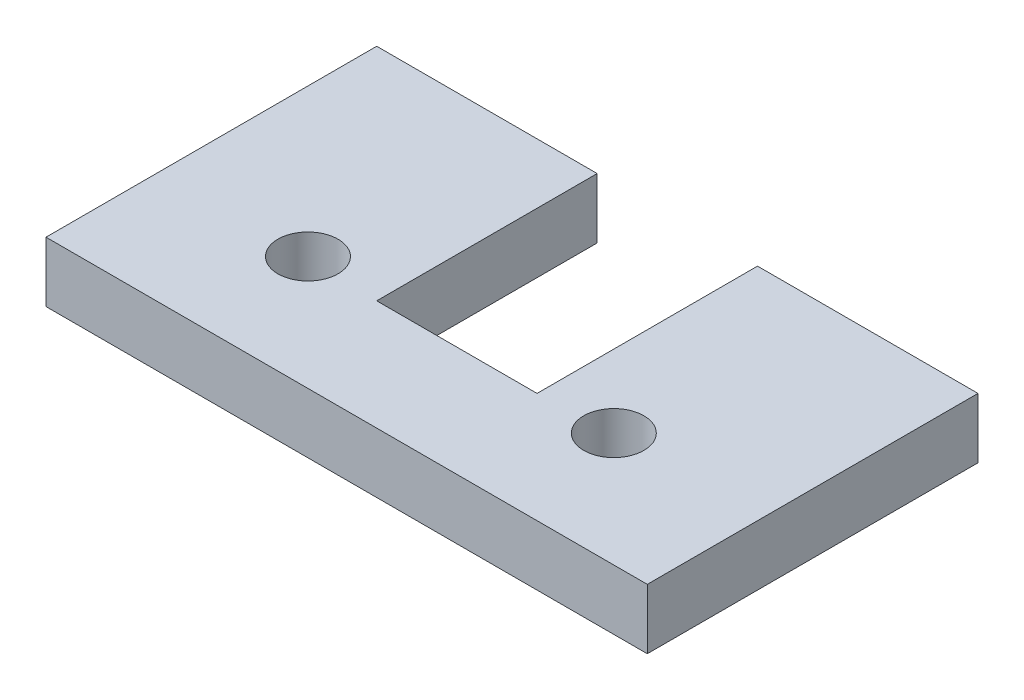
ISO-10303-21;
HEADER;
FILE_DESCRIPTION(('STEP AP214'),'2;1');
FILE_NAME('part.step','',(''),(''),'','','');
FILE_SCHEMA(('AUTOMOTIVE_DESIGN { 1 0 10303 214 1 1 1 1 }'));
ENDSEC;
DATA;
#1=APPLICATION_CONTEXT('core data for automotive mechanical design processes');
#2=APPLICATION_PROTOCOL_DEFINITION('international standard','automotive_design',2000,#1);
#3=PRODUCT_CONTEXT('',#1,'mechanical');
#4=PRODUCT('Part','Part','',(#3));
#5=PRODUCT_RELATED_PRODUCT_CATEGORY('part','',(#4));
#6=PRODUCT_DEFINITION_FORMATION('','',#4);
#7=PRODUCT_DEFINITION_CONTEXT('part definition',#1,'design');
#8=PRODUCT_DEFINITION('design','',#6,#7);
#9=PRODUCT_DEFINITION_SHAPE('','',#8);
#10=(LENGTH_UNIT() NAMED_UNIT(*) SI_UNIT(.MILLI.,.METRE.));
#11=(NAMED_UNIT(*) PLANE_ANGLE_UNIT() SI_UNIT($,.RADIAN.));
#12=(NAMED_UNIT(*) SI_UNIT($,.STERADIAN.) SOLID_ANGLE_UNIT());
#13=UNCERTAINTY_MEASURE_WITH_UNIT(LENGTH_MEASURE(1.E-05),#10,'distance_accuracy_value','');
#14=(GEOMETRIC_REPRESENTATION_CONTEXT(3) GLOBAL_UNCERTAINTY_ASSIGNED_CONTEXT((#13)) GLOBAL_UNIT_ASSIGNED_CONTEXT((#10,
#11,#12)) REPRESENTATION_CONTEXT('',''));
#15=CARTESIAN_POINT('',(0.,0.,0.));
#16=DIRECTION('',(0.,0.,1.));
#17=DIRECTION('',(1.,0.,0.));
#18=AXIS2_PLACEMENT_3D('',#15,#16,#17);
#19=CARTESIAN_POINT('',(11.,3.,0.));
#20=DIRECTION('',(1.,0.,0.));
#21=DIRECTION('',(0.,0.,-1.));
#22=AXIS2_PLACEMENT_3D('',#19,#20,#21);
#23=PLANE('',#22);
#24=DIRECTION('',(0.,0.,1.));
#25=VECTOR('',#24,1.);
#26=CARTESIAN_POINT('',(11.,0.,0.));
#27=LINE('',#26,#25);
#28=CARTESIAN_POINT('',(11.,0.,0.));
#29=VERTEX_POINT('',#28);
#30=CARTESIAN_POINT('',(11.,0.,16.5));
#31=VERTEX_POINT('',#30);
#32=EDGE_CURVE('E170',#29,#31,#27,.T.);
#33=ORIENTED_EDGE('',*,*,#32,.F.);
#34=DIRECTION('',(0.,-1.,0.));
#35=VECTOR('',#34,1.);
#36=CARTESIAN_POINT('',(11.,3.,0.));
#37=LINE('',#36,#35);
#38=CARTESIAN_POINT('',(11.,3.,0.));
#39=VERTEX_POINT('',#38);
#40=EDGE_CURVE('E11',#39,#29,#37,.T.);
#41=ORIENTED_EDGE('',*,*,#40,.F.);
#42=DIRECTION('',(0.,0.,1.));
#43=VECTOR('',#42,1.);
#44=CARTESIAN_POINT('',(11.,3.,0.));
#45=LINE('',#44,#43);
#46=CARTESIAN_POINT('',(11.,3.,16.5));
#47=VERTEX_POINT('',#46);
#48=EDGE_CURVE('E129',#39,#47,#45,.T.);
#49=ORIENTED_EDGE('',*,*,#48,.T.);
#50=DIRECTION('',(0.,-1.,0.));
#51=VECTOR('',#50,1.);
#52=CARTESIAN_POINT('',(11.,3.,16.5));
#53=LINE('',#52,#51);
#54=EDGE_CURVE('E83',#47,#31,#53,.T.);
#55=ORIENTED_EDGE('',*,*,#54,.T.);
#56=EDGE_LOOP('',(#33,#41,#49,#55));
#57=FACE_BOUND('',#56,.T.);
#58=ADVANCED_FACE('F33',(#57),#23,.T.);
#59=CARTESIAN_POINT('',(0.,3.,0.));
#60=DIRECTION('',(0.,0.,-1.));
#61=DIRECTION('',(-1.,0.,0.));
#62=AXIS2_PLACEMENT_3D('',#59,#60,#61);
#63=PLANE('',#62);
#64=DIRECTION('',(1.,0.,0.));
#65=VECTOR('',#64,1.);
#66=CARTESIAN_POINT('',(0.,0.,0.));
#67=LINE('',#66,#65);
#68=CARTESIAN_POINT('',(0.,0.,0.));
#69=VERTEX_POINT('',#68);
#70=EDGE_CURVE('E164',#69,#29,#67,.T.);
#71=ORIENTED_EDGE('',*,*,#70,.F.);
#72=DIRECTION('',(0.,-1.,0.));
#73=VECTOR('',#72,1.);
#74=CARTESIAN_POINT('',(0.,3.,0.));
#75=LINE('',#74,#73);
#76=CARTESIAN_POINT('',(0.,3.,0.));
#77=VERTEX_POINT('',#76);
#78=EDGE_CURVE('E41',#77,#69,#75,.T.);
#79=ORIENTED_EDGE('',*,*,#78,.F.);
#80=DIRECTION('',(1.,0.,0.));
#81=VECTOR('',#80,1.);
#82=CARTESIAN_POINT('',(0.,3.,0.));
#83=LINE('',#82,#81);
#84=EDGE_CURVE('E122',#77,#39,#83,.T.);
#85=ORIENTED_EDGE('',*,*,#84,.T.);
#86=ORIENTED_EDGE('',*,*,#40,.T.);
#87=EDGE_LOOP('',(#71,#79,#85,#86));
#88=FACE_BOUND('',#87,.T.);
#89=ADVANCED_FACE('F169',(#88),#63,.T.);
#90=CARTESIAN_POINT('',(0.,3.,0.));
#91=DIRECTION('',(1.,0.,0.));
#92=DIRECTION('',(0.,0.,-1.));
#93=AXIS2_PLACEMENT_3D('',#90,#91,#92);
#94=PLANE('',#93);
#95=DIRECTION('',(0.,0.,1.));
#96=VECTOR('',#95,1.);
#97=CARTESIAN_POINT('',(0.,0.,0.));
#98=LINE('',#97,#96);
#99=CARTESIAN_POINT('',(0.,0.,11.));
#100=VERTEX_POINT('',#99);
#101=EDGE_CURVE('E156',#69,#100,#98,.T.);
#102=ORIENTED_EDGE('',*,*,#101,.T.);
#103=DIRECTION('',(0.,-1.,0.));
#104=VECTOR('',#103,1.);
#105=CARTESIAN_POINT('',(0.,3.,11.));
#106=LINE('',#105,#104);
#107=CARTESIAN_POINT('',(0.,3.,11.));
#108=VERTEX_POINT('',#107);
#109=EDGE_CURVE('E149',#108,#100,#106,.T.);
#110=ORIENTED_EDGE('',*,*,#109,.F.);
#111=DIRECTION('',(0.,0.,1.));
#112=VECTOR('',#111,1.);
#113=CARTESIAN_POINT('',(0.,3.,0.));
#114=LINE('',#113,#112);
#115=EDGE_CURVE('E128',#77,#108,#114,.T.);
#116=ORIENTED_EDGE('',*,*,#115,.F.);
#117=ORIENTED_EDGE('',*,*,#78,.T.);
#118=EDGE_LOOP('',(#102,#110,#116,#117));
#119=FACE_BOUND('',#118,.T.);
#120=ADVANCED_FACE('F154',(#119),#94,.F.);
#121=CARTESIAN_POINT('',(0.,3.,11.));
#122=DIRECTION('',(0.,0.,1.));
#123=DIRECTION('',(1.,0.,0.));
#124=AXIS2_PLACEMENT_3D('',#121,#122,#123);
#125=PLANE('',#124);
#126=DIRECTION('',(-1.,0.,0.));
#127=VECTOR('',#126,1.);
#128=CARTESIAN_POINT('',(0.,0.,11.));
#129=LINE('',#128,#127);
#130=CARTESIAN_POINT('',(-8.,0.,11.));
#131=VERTEX_POINT('',#130);
#132=EDGE_CURVE('E167',#100,#131,#129,.T.);
#133=ORIENTED_EDGE('',*,*,#132,.T.);
#134=DIRECTION('',(0.,-1.,0.));
#135=VECTOR('',#134,1.);
#136=CARTESIAN_POINT('',(-8.,3.,11.));
#137=LINE('',#136,#135);
#138=CARTESIAN_POINT('',(-8.,3.,11.));
#139=VERTEX_POINT('',#138);
#140=EDGE_CURVE('E147',#139,#131,#137,.T.);
#141=ORIENTED_EDGE('',*,*,#140,.F.);
#142=DIRECTION('',(-1.,0.,0.));
#143=VECTOR('',#142,1.);
#144=CARTESIAN_POINT('',(0.,3.,11.));
#145=LINE('',#144,#143);
#146=EDGE_CURVE('E123',#108,#139,#145,.T.);
#147=ORIENTED_EDGE('',*,*,#146,.F.);
#148=ORIENTED_EDGE('',*,*,#109,.T.);
#149=EDGE_LOOP('',(#133,#141,#147,#148));
#150=FACE_BOUND('',#149,.T.);
#151=ADVANCED_FACE('F189',(#150),#125,.F.);
#152=CARTESIAN_POINT('',(-8.,3.,0.));
#153=DIRECTION('',(1.,0.,0.));
#154=DIRECTION('',(0.,0.,-1.));
#155=AXIS2_PLACEMENT_3D('',#152,#153,#154);
#156=PLANE('',#155);
#157=DIRECTION('',(0.,0.,1.));
#158=VECTOR('',#157,1.);
#159=CARTESIAN_POINT('',(-8.,0.,0.));
#160=LINE('',#159,#158);
#161=CARTESIAN_POINT('',(-8.,0.,0.));
#162=VERTEX_POINT('',#161);
#163=EDGE_CURVE('E173',#162,#131,#160,.T.);
#164=ORIENTED_EDGE('',*,*,#163,.F.);
#165=DIRECTION('',(0.,-1.,0.));
#166=VECTOR('',#165,1.);
#167=CARTESIAN_POINT('',(-8.,3.,0.));
#168=LINE('',#167,#166);
#169=CARTESIAN_POINT('',(-8.,3.,0.));
#170=VERTEX_POINT('',#169);
#171=EDGE_CURVE('E110',#170,#162,#168,.T.);
#172=ORIENTED_EDGE('',*,*,#171,.F.);
#173=DIRECTION('',(0.,0.,1.));
#174=VECTOR('',#173,1.);
#175=CARTESIAN_POINT('',(-8.,3.,0.));
#176=LINE('',#175,#174);
#177=EDGE_CURVE('E120',#170,#139,#176,.T.);
#178=ORIENTED_EDGE('',*,*,#177,.T.);
#179=ORIENTED_EDGE('',*,*,#140,.T.);
#180=EDGE_LOOP('',(#164,#172,#178,#179));
#181=FACE_BOUND('',#180,.T.);
#182=ADVANCED_FACE('F193',(#181),#156,.T.);
#183=CARTESIAN_POINT('',(-19.,0.,0.));
#184=VERTEX_POINT('',#183);
#185=EDGE_CURVE('E109',#184,#162,#67,.T.);
#186=ORIENTED_EDGE('',*,*,#185,.F.);
#187=DIRECTION('',(0.,-1.,0.));
#188=VECTOR('',#187,1.);
#189=CARTESIAN_POINT('',(-19.,3.,0.));
#190=LINE('',#189,#188);
#191=CARTESIAN_POINT('',(-19.,3.,0.));
#192=VERTEX_POINT('',#191);
#193=EDGE_CURVE('E103',#192,#184,#190,.T.);
#194=ORIENTED_EDGE('',*,*,#193,.F.);
#195=EDGE_CURVE('E107',#192,#170,#83,.T.);
#196=ORIENTED_EDGE('',*,*,#195,.T.);
#197=ORIENTED_EDGE('',*,*,#171,.T.);
#198=EDGE_LOOP('',(#186,#194,#196,#197));
#199=FACE_BOUND('',#198,.T.);
#200=ADVANCED_FACE('F105',(#199),#63,.T.);
#201=CARTESIAN_POINT('',(-19.,3.,0.));
#202=DIRECTION('',(1.,0.,0.));
#203=DIRECTION('',(0.,0.,-1.));
#204=AXIS2_PLACEMENT_3D('',#201,#202,#203);
#205=PLANE('',#204);
#206=DIRECTION('',(0.,0.,1.));
#207=VECTOR('',#206,1.);
#208=CARTESIAN_POINT('',(-19.,0.,0.));
#209=LINE('',#208,#207);
#210=CARTESIAN_POINT('',(-19.,0.,16.5));
#211=VERTEX_POINT('',#210);
#212=EDGE_CURVE('E76',#184,#211,#209,.T.);
#213=ORIENTED_EDGE('',*,*,#212,.T.);
#214=DIRECTION('',(0.,-1.,0.));
#215=VECTOR('',#214,1.);
#216=CARTESIAN_POINT('',(-19.,3.,16.5));
#217=LINE('',#216,#215);
#218=CARTESIAN_POINT('',(-19.,3.,16.5));
#219=VERTEX_POINT('',#218);
#220=EDGE_CURVE('E111',#219,#211,#217,.T.);
#221=ORIENTED_EDGE('',*,*,#220,.F.);
#222=DIRECTION('',(0.,0.,1.));
#223=VECTOR('',#222,1.);
#224=CARTESIAN_POINT('',(-19.,3.,0.));
#225=LINE('',#224,#223);
#226=EDGE_CURVE('E113',#192,#219,#225,.T.);
#227=ORIENTED_EDGE('',*,*,#226,.F.);
#228=ORIENTED_EDGE('',*,*,#193,.T.);
#229=EDGE_LOOP('',(#213,#221,#227,#228));
#230=FACE_BOUND('',#229,.T.);
#231=ADVANCED_FACE('F114',(#230),#205,.F.);
#232=CARTESIAN_POINT('',(3.63,3.,10.8));
#233=DIRECTION('',(0.,-1.,0.));
#234=DIRECTION('',(0.,0.,-1.));
#235=AXIS2_PLACEMENT_3D('',#232,#233,#234);
#236=CYLINDRICAL_SURFACE('',#235,1.5);
#237=CARTESIAN_POINT('',(3.63,3.,10.8));
#238=DIRECTION('',(0.,1.,0.));
#239=DIRECTION('',(0.,0.,1.));
#240=AXIS2_PLACEMENT_3D('',#237,#238,#239);
#241=CIRCLE('',#240,1.5);
#242=CARTESIAN_POINT('',(3.63,3.,12.3));
#243=VERTEX_POINT('',#242);
#244=EDGE_CURVE('E210',#243,#243,#241,.T.);
#245=ORIENTED_EDGE('',*,*,#244,.T.);
#246=EDGE_LOOP('',(#245));
#247=FACE_BOUND('',#246,.T.);
#248=CARTESIAN_POINT('',(3.63,0.,10.8));
#249=DIRECTION('',(0.,1.,0.));
#250=DIRECTION('',(0.,0.,1.));
#251=AXIS2_PLACEMENT_3D('',#248,#249,#250);
#252=CIRCLE('',#251,1.5);
#253=CARTESIAN_POINT('',(3.63,0.,12.3));
#254=VERTEX_POINT('',#253);
#255=EDGE_CURVE('E134',#254,#254,#252,.T.);
#256=ORIENTED_EDGE('',*,*,#255,.F.);
#257=EDGE_LOOP('',(#256));
#258=FACE_BOUND('',#257,.T.);
#259=ADVANCED_FACE('F198',(#247,#258),#236,.F.);
#260=CARTESIAN_POINT('',(0.,3.,16.5));
#261=DIRECTION('',(0.,0.,-1.));
#262=DIRECTION('',(-1.,0.,0.));
#263=AXIS2_PLACEMENT_3D('',#260,#261,#262);
#264=PLANE('',#263);
#265=DIRECTION('',(1.,0.,0.));
#266=VECTOR('',#265,1.);
#267=CARTESIAN_POINT('',(0.,0.,16.5));
#268=LINE('',#267,#266);
#269=EDGE_CURVE('E139',#211,#31,#268,.T.);
#270=ORIENTED_EDGE('',*,*,#269,.T.);
#271=ORIENTED_EDGE('',*,*,#54,.F.);
#272=DIRECTION('',(1.,0.,0.));
#273=VECTOR('',#272,1.);
#274=CARTESIAN_POINT('',(0.,3.,16.5));
#275=LINE('',#274,#273);
#276=EDGE_CURVE('E49',#219,#47,#275,.T.);
#277=ORIENTED_EDGE('',*,*,#276,.F.);
#278=ORIENTED_EDGE('',*,*,#220,.T.);
#279=EDGE_LOOP('',(#270,#271,#277,#278));
#280=FACE_BOUND('',#279,.T.);
#281=ADVANCED_FACE('F180',(#280),#264,.F.);
#282=CARTESIAN_POINT('',(-11.63,3.,10.8));
#283=DIRECTION('',(0.,-1.,0.));
#284=DIRECTION('',(0.,0.,-1.));
#285=AXIS2_PLACEMENT_3D('',#282,#283,#284);
#286=CYLINDRICAL_SURFACE('',#285,1.5);
#287=CARTESIAN_POINT('',(-11.63,3.,10.8));
#288=DIRECTION('',(0.,1.,0.));
#289=DIRECTION('',(0.,0.,1.));
#290=AXIS2_PLACEMENT_3D('',#287,#288,#289);
#291=CIRCLE('',#290,1.5);
#292=CARTESIAN_POINT('',(-11.63,3.,12.3));
#293=VERTEX_POINT('',#292);
#294=EDGE_CURVE('E144',#293,#293,#291,.F.);
#295=ORIENTED_EDGE('',*,*,#294,.F.);
#296=EDGE_LOOP('',(#295));
#297=FACE_BOUND('',#296,.T.);
#298=CARTESIAN_POINT('',(-11.63,0.,10.8));
#299=DIRECTION('',(0.,1.,0.));
#300=DIRECTION('',(0.,0.,1.));
#301=AXIS2_PLACEMENT_3D('',#298,#299,#300);
#302=CIRCLE('',#301,1.5);
#303=CARTESIAN_POINT('',(-11.63,0.,12.3));
#304=VERTEX_POINT('',#303);
#305=EDGE_CURVE('E132',#304,#304,#302,.F.);
#306=ORIENTED_EDGE('',*,*,#305,.T.);
#307=EDGE_LOOP('',(#306));
#308=FACE_BOUND('',#307,.T.);
#309=ADVANCED_FACE('F217',(#297,#308),#286,.F.);
#310=CARTESIAN_POINT('',(0.,3.,0.));
#311=DIRECTION('',(0.,1.,0.));
#312=DIRECTION('',(0.,0.,1.));
#313=AXIS2_PLACEMENT_3D('',#310,#311,#312);
#314=PLANE('',#313);
#315=ORIENTED_EDGE('',*,*,#48,.F.);
#316=ORIENTED_EDGE('',*,*,#84,.F.);
#317=ORIENTED_EDGE('',*,*,#115,.T.);
#318=ORIENTED_EDGE('',*,*,#146,.T.);
#319=ORIENTED_EDGE('',*,*,#177,.F.);
#320=ORIENTED_EDGE('',*,*,#195,.F.);
#321=ORIENTED_EDGE('',*,*,#226,.T.);
#322=ORIENTED_EDGE('',*,*,#276,.T.);
#323=EDGE_LOOP('',(#315,#316,#317,#318,#319,#320,#321,#322));
#324=FACE_BOUND('',#323,.T.);
#325=ORIENTED_EDGE('',*,*,#244,.F.);
#326=EDGE_LOOP('',(#325));
#327=FACE_BOUND('',#326,.T.);
#328=ORIENTED_EDGE('',*,*,#294,.T.);
#329=EDGE_LOOP('',(#328));
#330=FACE_BOUND('',#329,.T.);
#331=ADVANCED_FACE('F117',(#324,#327,#330),#314,.T.);
#332=CARTESIAN_POINT('',(0.,0.,0.));
#333=DIRECTION('',(0.,1.,0.));
#334=DIRECTION('',(0.,0.,1.));
#335=AXIS2_PLACEMENT_3D('',#332,#333,#334);
#336=PLANE('',#335);
#337=ORIENTED_EDGE('',*,*,#32,.T.);
#338=ORIENTED_EDGE('',*,*,#269,.F.);
#339=ORIENTED_EDGE('',*,*,#212,.F.);
#340=ORIENTED_EDGE('',*,*,#185,.T.);
#341=ORIENTED_EDGE('',*,*,#163,.T.);
#342=ORIENTED_EDGE('',*,*,#132,.F.);
#343=ORIENTED_EDGE('',*,*,#101,.F.);
#344=ORIENTED_EDGE('',*,*,#70,.T.);
#345=EDGE_LOOP('',(#337,#338,#339,#340,#341,#342,#343,#344));
#346=FACE_BOUND('',#345,.T.);
#347=ORIENTED_EDGE('',*,*,#255,.T.);
#348=EDGE_LOOP('',(#347));
#349=FACE_BOUND('',#348,.T.);
#350=ORIENTED_EDGE('',*,*,#305,.F.);
#351=EDGE_LOOP('',(#350));
#352=FACE_BOUND('',#351,.T.);
#353=ADVANCED_FACE('F162',(#346,#349,#352),#336,.F.);
#354=CLOSED_SHELL('',(#58,#89,#120,#151,#182,#200,#231,#259,#281,#309,#331,#353));
#355=MANIFOLD_SOLID_BREP('B2',#354);
#356=ADVANCED_BREP_SHAPE_REPRESENTATION('',(#18,#355),#14);
#357=SHAPE_DEFINITION_REPRESENTATION(#9,#356);
ENDSEC;
END-ISO-10303-21;
